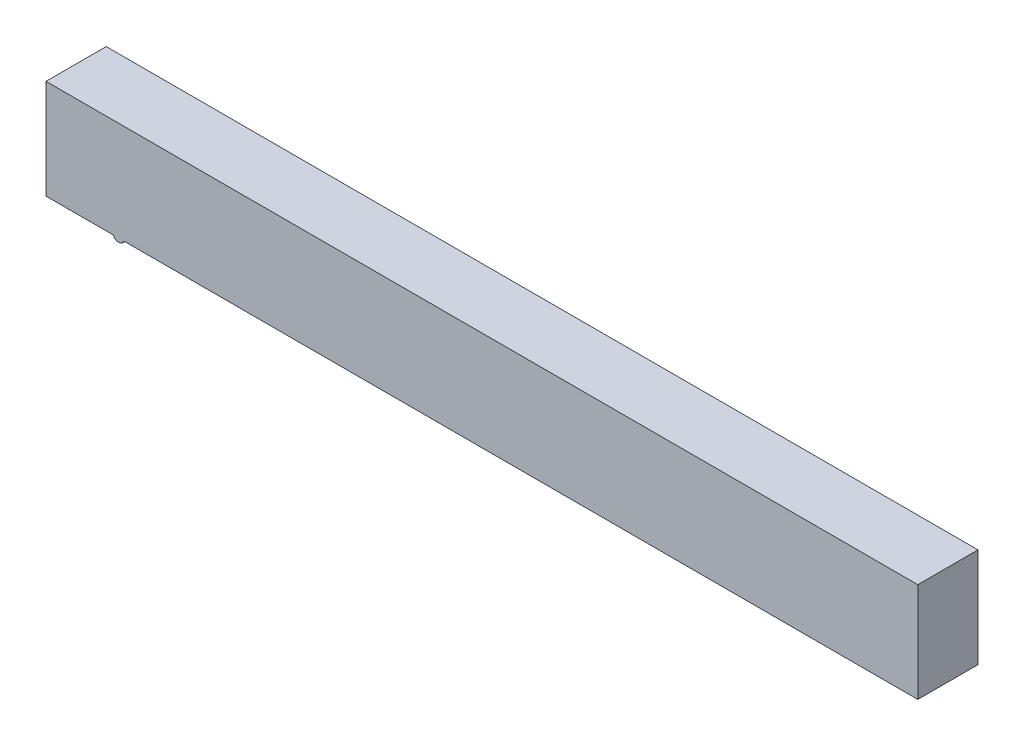
ISO-10303-21;
HEADER;
FILE_DESCRIPTION(('STEP AP214'),'2;1');
FILE_NAME('part.step','',(''),(''),'','','');
FILE_SCHEMA(('AUTOMOTIVE_DESIGN { 1 0 10303 214 1 1 1 1 }'));
ENDSEC;
DATA;
#1=APPLICATION_CONTEXT('core data for automotive mechanical design processes');
#2=APPLICATION_PROTOCOL_DEFINITION('international standard','automotive_design',2000,#1);
#3=PRODUCT_CONTEXT('',#1,'mechanical');
#4=PRODUCT('Part','Part','',(#3));
#5=PRODUCT_RELATED_PRODUCT_CATEGORY('part','',(#4));
#6=PRODUCT_DEFINITION_FORMATION('','',#4);
#7=PRODUCT_DEFINITION_CONTEXT('part definition',#1,'design');
#8=PRODUCT_DEFINITION('design','',#6,#7);
#9=PRODUCT_DEFINITION_SHAPE('','',#8);
#10=(LENGTH_UNIT() NAMED_UNIT(*) SI_UNIT(.MILLI.,.METRE.));
#11=(NAMED_UNIT(*) PLANE_ANGLE_UNIT() SI_UNIT($,.RADIAN.));
#12=(NAMED_UNIT(*) SI_UNIT($,.STERADIAN.) SOLID_ANGLE_UNIT());
#13=UNCERTAINTY_MEASURE_WITH_UNIT(LENGTH_MEASURE(1.E-05),#10,'distance_accuracy_value','');
#14=(GEOMETRIC_REPRESENTATION_CONTEXT(3) GLOBAL_UNCERTAINTY_ASSIGNED_CONTEXT((#13)) GLOBAL_UNIT_ASSIGNED_CONTEXT((#10,
#11,#12)) REPRESENTATION_CONTEXT('',''));
#15=CARTESIAN_POINT('',(0.,0.,0.));
#16=DIRECTION('',(0.,0.,1.));
#17=DIRECTION('',(1.,0.,0.));
#18=AXIS2_PLACEMENT_3D('',#15,#16,#17);
#19=CARTESIAN_POINT('',(-22.86,-2.286,2.));
#20=DIRECTION('',(-0.195145820877009,0.980774239361046,0.));
#21=DIRECTION('',(-0.980774239361046,-0.195145820877009,0.));
#22=AXIS2_PLACEMENT_3D('',#19,#20,#21);
#23=PLANE('',#22);
#24=DIRECTION('',(0.,0.,1.));
#25=VECTOR('',#24,1.);
#26=CARTESIAN_POINT('',(-22.86,-2.286,2.));
#27=LINE('',#26,#25);
#28=CARTESIAN_POINT('',(-22.86,-2.286,6.));
#29=VERTEX_POINT('',#28);
#30=CARTESIAN_POINT('',(-22.86,-2.286,2.));
#31=VERTEX_POINT('',#30);
#32=EDGE_CURVE('E123',#29,#31,#27,.F.);
#33=ORIENTED_EDGE('',*,*,#32,.T.);
#34=DIRECTION('',(-0.980774239361046,-0.195145820877009,0.));
#35=VECTOR('',#34,1.);
#36=CARTESIAN_POINT('',(-22.86,-2.286,2.));
#37=LINE('',#36,#35);
#38=CARTESIAN_POINT('',(-22.7142,-2.25699,2.));
#39=VERTEX_POINT('',#38);
#40=EDGE_CURVE('E20',#39,#31,#37,.T.);
#41=ORIENTED_EDGE('',*,*,#40,.F.);
#42=DIRECTION('',(0.,0.,1.));
#43=VECTOR('',#42,1.);
#44=CARTESIAN_POINT('',(-22.7142,-2.25699,2.));
#45=LINE('',#44,#43);
#46=CARTESIAN_POINT('',(-22.7142,-2.25699,6.));
#47=VERTEX_POINT('',#46);
#48=EDGE_CURVE('E141',#39,#47,#45,.T.);
#49=ORIENTED_EDGE('',*,*,#48,.T.);
#50=DIRECTION('',(-0.980774239361046,-0.195145820877009,0.));
#51=VECTOR('',#50,1.);
#52=CARTESIAN_POINT('',(-22.86,-2.286,6.));
#53=LINE('',#52,#51);
#54=EDGE_CURVE('E109',#29,#47,#53,.F.);
#55=ORIENTED_EDGE('',*,*,#54,.F.);
#56=EDGE_LOOP('',(#33,#41,#49,#55));
#57=FACE_BOUND('',#56,.T.);
#58=ADVANCED_FACE('F17',(#57),#23,.F.);
#59=CARTESIAN_POINT('',(-23.0058,-2.25699,2.));
#60=DIRECTION('',(0.195145820877009,0.980774239361046,0.));
#61=DIRECTION('',(-0.980774239361046,0.195145820877009,0.));
#62=AXIS2_PLACEMENT_3D('',#59,#60,#61);
#63=PLANE('',#62);
#64=DIRECTION('',(0.,0.,1.));
#65=VECTOR('',#64,1.);
#66=CARTESIAN_POINT('',(-23.0058,-2.25699000000003,2.));
#67=LINE('',#66,#65);
#68=CARTESIAN_POINT('',(-23.0058,-2.25699000000001,6.));
#69=VERTEX_POINT('',#68);
#70=CARTESIAN_POINT('',(-23.0058,-2.25699000000001,2.));
#71=VERTEX_POINT('',#70);
#72=EDGE_CURVE('E128',#69,#71,#67,.F.);
#73=ORIENTED_EDGE('',*,*,#72,.T.);
#74=DIRECTION('',(-0.980774239361046,0.195145820877009,0.));
#75=VECTOR('',#74,1.);
#76=CARTESIAN_POINT('',(-23.0058,-2.25699,2.));
#77=LINE('',#76,#75);
#78=EDGE_CURVE('E117',#31,#71,#77,.T.);
#79=ORIENTED_EDGE('',*,*,#78,.F.);
#80=ORIENTED_EDGE('',*,*,#32,.F.);
#81=DIRECTION('',(-0.980774239361046,0.195145820877009,0.));
#82=VECTOR('',#81,1.);
#83=CARTESIAN_POINT('',(-23.0058,-2.25699,6.));
#84=LINE('',#83,#82);
#85=EDGE_CURVE('E130',#69,#29,#84,.F.);
#86=ORIENTED_EDGE('',*,*,#85,.F.);
#87=EDGE_LOOP('',(#73,#79,#80,#86));
#88=FACE_BOUND('',#87,.T.);
#89=ADVANCED_FACE('F126',(#88),#63,.F.);
#90=CARTESIAN_POINT('',(-22.7142,-2.25699,2.));
#91=DIRECTION('',(-0.555584744670956,0.831459915743934,0.));
#92=DIRECTION('',(-0.831459915743934,-0.555584744670956,0.));
#93=AXIS2_PLACEMENT_3D('',#90,#91,#92);
#94=PLANE('',#93);
#95=ORIENTED_EDGE('',*,*,#48,.F.);
#96=DIRECTION('',(-0.831459915743934,-0.555584744670956,0.));
#97=VECTOR('',#96,1.);
#98=CARTESIAN_POINT('',(-22.7142,-2.25699,2.));
#99=LINE('',#98,#97);
#100=CARTESIAN_POINT('',(-22.5906,-2.17439999999999,2.));
#101=VERTEX_POINT('',#100);
#102=EDGE_CURVE('E120',#101,#39,#99,.T.);
#103=ORIENTED_EDGE('',*,*,#102,.F.);
#104=DIRECTION('',(0.,0.,1.));
#105=VECTOR('',#104,1.);
#106=CARTESIAN_POINT('',(-22.5906,-2.1744,2.));
#107=LINE('',#106,#105);
#108=CARTESIAN_POINT('',(-22.5906,-2.17439999999998,6.));
#109=VERTEX_POINT('',#108);
#110=EDGE_CURVE('E146',#101,#109,#107,.T.);
#111=ORIENTED_EDGE('',*,*,#110,.T.);
#112=DIRECTION('',(-0.831459915743934,-0.555584744670956,0.));
#113=VECTOR('',#112,1.);
#114=CARTESIAN_POINT('',(-22.7142,-2.25699,6.));
#115=LINE('',#114,#113);
#116=EDGE_CURVE('E138',#47,#109,#115,.F.);
#117=ORIENTED_EDGE('',*,*,#116,.F.);
#118=EDGE_LOOP('',(#95,#103,#111,#117));
#119=FACE_BOUND('',#118,.T.);
#120=ADVANCED_FACE('F144',(#119),#94,.F.);
#121=CARTESIAN_POINT('',(-23.1294,-2.1744,2.));
#122=DIRECTION('',(0.555584744670956,0.831459915743934,0.));
#123=DIRECTION('',(-0.831459915743934,0.555584744670956,0.));
#124=AXIS2_PLACEMENT_3D('',#121,#122,#123);
#125=PLANE('',#124);
#126=DIRECTION('',(0.,0.,1.));
#127=VECTOR('',#126,1.);
#128=CARTESIAN_POINT('',(-23.1294,-2.17439999999998,2.));
#129=LINE('',#128,#127);
#130=CARTESIAN_POINT('',(-23.1294,-2.17439999999999,6.));
#131=VERTEX_POINT('',#130);
#132=CARTESIAN_POINT('',(-23.1294,-2.17439999999999,2.));
#133=VERTEX_POINT('',#132);
#134=EDGE_CURVE('E160',#131,#133,#129,.F.);
#135=ORIENTED_EDGE('',*,*,#134,.T.);
#136=DIRECTION('',(-0.831459915743934,0.555584744670956,0.));
#137=VECTOR('',#136,1.);
#138=CARTESIAN_POINT('',(-23.1294,-2.1744,2.));
#139=LINE('',#138,#137);
#140=EDGE_CURVE('E149',#71,#133,#139,.T.);
#141=ORIENTED_EDGE('',*,*,#140,.F.);
#142=ORIENTED_EDGE('',*,*,#72,.F.);
#143=DIRECTION('',(-0.831459915743934,0.555584744670956,0.));
#144=VECTOR('',#143,1.);
#145=CARTESIAN_POINT('',(-23.1294,-2.1744,6.));
#146=LINE('',#145,#144);
#147=EDGE_CURVE('E153',#131,#69,#146,.F.);
#148=ORIENTED_EDGE('',*,*,#147,.F.);
#149=EDGE_LOOP('',(#135,#141,#142,#148));
#150=FACE_BOUND('',#149,.T.);
#151=ADVANCED_FACE('F250',(#150),#125,.F.);
#152=CARTESIAN_POINT('',(-22.5906,-2.1744,2.));
#153=DIRECTION('',(-0.831459915743934,0.555584744670956,0.));
#154=DIRECTION('',(-0.555584744670956,-0.831459915743934,0.));
#155=AXIS2_PLACEMENT_3D('',#152,#153,#154);
#156=PLANE('',#155);
#157=ORIENTED_EDGE('',*,*,#110,.F.);
#158=DIRECTION('',(-0.555584744670956,-0.831459915743934,0.));
#159=VECTOR('',#158,1.);
#160=CARTESIAN_POINT('',(-22.5906,-2.1744,2.));
#161=LINE('',#160,#159);
#162=CARTESIAN_POINT('',(-22.50801,-2.05080000000001,2.));
#163=VERTEX_POINT('',#162);
#164=EDGE_CURVE('E155',#163,#101,#161,.T.);
#165=ORIENTED_EDGE('',*,*,#164,.F.);
#166=DIRECTION('',(0.,0.,1.));
#167=VECTOR('',#166,1.);
#168=CARTESIAN_POINT('',(-22.50801,-2.0508,2.));
#169=LINE('',#168,#167);
#170=CARTESIAN_POINT('',(-22.50801,-2.05080000000001,6.));
#171=VERTEX_POINT('',#170);
#172=EDGE_CURVE('E170',#163,#171,#169,.T.);
#173=ORIENTED_EDGE('',*,*,#172,.T.);
#174=DIRECTION('',(-0.555584744670956,-0.831459915743934,0.));
#175=VECTOR('',#174,1.);
#176=CARTESIAN_POINT('',(-22.5906,-2.1744,6.));
#177=LINE('',#176,#175);
#178=EDGE_CURVE('E158',#109,#171,#177,.F.);
#179=ORIENTED_EDGE('',*,*,#178,.F.);
#180=EDGE_LOOP('',(#157,#165,#173,#179));
#181=FACE_BOUND('',#180,.T.);
#182=ADVANCED_FACE('F247',(#181),#156,.F.);
#183=CARTESIAN_POINT('',(-23.21199,-2.0508,2.));
#184=DIRECTION('',(0.831459915743934,0.555584744670956,0.));
#185=DIRECTION('',(-0.555584744670956,0.831459915743934,0.));
#186=AXIS2_PLACEMENT_3D('',#183,#184,#185);
#187=PLANE('',#186);
#188=DIRECTION('',(0.,0.,1.));
#189=VECTOR('',#188,1.);
#190=CARTESIAN_POINT('',(-23.211989999994,-2.05079999999881,2.));
#191=LINE('',#190,#189);
#192=CARTESIAN_POINT('',(-23.2119899999985,-2.0507999999997,6.));
#193=VERTEX_POINT('',#192);
#194=CARTESIAN_POINT('',(-23.2119899999985,-2.0507999999997,2.));
#195=VERTEX_POINT('',#194);
#196=EDGE_CURVE('E173',#193,#195,#191,.F.);
#197=ORIENTED_EDGE('',*,*,#196,.T.);
#198=DIRECTION('',(-0.555584744670956,0.831459915743934,0.));
#199=VECTOR('',#198,1.);
#200=CARTESIAN_POINT('',(-23.21199,-2.0508,2.));
#201=LINE('',#200,#199);
#202=EDGE_CURVE('E163',#133,#195,#201,.T.);
#203=ORIENTED_EDGE('',*,*,#202,.F.);
#204=ORIENTED_EDGE('',*,*,#134,.F.);
#205=DIRECTION('',(-0.555584744670956,0.831459915743934,0.));
#206=VECTOR('',#205,1.);
#207=CARTESIAN_POINT('',(-23.21199,-2.0508,6.));
#208=LINE('',#207,#206);
#209=EDGE_CURVE('E165',#193,#131,#208,.F.);
#210=ORIENTED_EDGE('',*,*,#209,.F.);
#211=EDGE_LOOP('',(#197,#203,#204,#210));
#212=FACE_BOUND('',#211,.T.);
#213=ADVANCED_FACE('F249',(#212),#187,.F.);
#214=CARTESIAN_POINT('',(-22.50801,-2.0508,2.));
#215=DIRECTION('',(-0.980774239361046,0.195145820877009,0.));
#216=DIRECTION('',(-0.195145820877009,-0.980774239361046,0.));
#217=AXIS2_PLACEMENT_3D('',#214,#215,#216);
#218=PLANE('',#217);
#219=ORIENTED_EDGE('',*,*,#172,.F.);
#220=DIRECTION('',(-0.195145820877009,-0.980774239361046,0.));
#221=VECTOR('',#220,1.);
#222=CARTESIAN_POINT('',(-22.50801,-2.0508,2.));
#223=LINE('',#222,#221);
#224=CARTESIAN_POINT('',(-22.5042693415618,-2.03199999999964,2.));
#225=VERTEX_POINT('',#224);
#226=EDGE_CURVE('E168',#225,#163,#223,.T.);
#227=ORIENTED_EDGE('',*,*,#226,.F.);
#228=DIRECTION('',(0.,0.,1.));
#229=VECTOR('',#228,1.);
#230=CARTESIAN_POINT('',(-22.50426934156,-2.032,2.));
#231=LINE('',#230,#229);
#232=CARTESIAN_POINT('',(-22.5042693415618,-2.03199999999964,6.));
#233=VERTEX_POINT('',#232);
#234=EDGE_CURVE('E192',#225,#233,#231,.T.);
#235=ORIENTED_EDGE('',*,*,#234,.T.);
#236=DIRECTION('',(-0.195145821066923,-0.980774239323259,0.));
#237=VECTOR('',#236,1.);
#238=CARTESIAN_POINT('',(-22.50426934156,-2.032,6.));
#239=LINE('',#238,#237);
#240=EDGE_CURVE('E178',#233,#171,#239,.T.);
#241=ORIENTED_EDGE('',*,*,#240,.T.);
#242=EDGE_LOOP('',(#219,#227,#235,#241));
#243=FACE_BOUND('',#242,.T.);
#244=ADVANCED_FACE('F244',(#243),#218,.F.);
#245=CARTESIAN_POINT('',(-23.21573065843,-2.032,2.));
#246=DIRECTION('',(0.980774239361046,0.195145820877009,0.));
#247=DIRECTION('',(-0.195145820877009,0.980774239361046,0.));
#248=AXIS2_PLACEMENT_3D('',#245,#246,#247);
#249=PLANE('',#248);
#250=DIRECTION('',(0.,0.,1.));
#251=VECTOR('',#250,1.);
#252=CARTESIAN_POINT('',(-23.21573065843,-2.032,2.));
#253=LINE('',#252,#251);
#254=CARTESIAN_POINT('',(-23.21573065843,-2.032,6.));
#255=VERTEX_POINT('',#254);
#256=CARTESIAN_POINT('',(-23.21573065843,-2.032,2.));
#257=VERTEX_POINT('',#256);
#258=EDGE_CURVE('E197',#255,#257,#253,.F.);
#259=ORIENTED_EDGE('',*,*,#258,.T.);
#260=DIRECTION('',(-0.195145820877009,0.980774239361046,0.));
#261=VECTOR('',#260,1.);
#262=CARTESIAN_POINT('',(-23.21573065843,-2.032,2.));
#263=LINE('',#262,#261);
#264=EDGE_CURVE('E176',#195,#257,#263,.T.);
#265=ORIENTED_EDGE('',*,*,#264,.F.);
#266=ORIENTED_EDGE('',*,*,#196,.F.);
#267=DIRECTION('',(-0.195145820564806,0.980774239423165,0.));
#268=VECTOR('',#267,1.);
#269=CARTESIAN_POINT('',(-23.21199,-2.0508,6.));
#270=LINE('',#269,#268);
#271=EDGE_CURVE('E181',#193,#255,#270,.T.);
#272=ORIENTED_EDGE('',*,*,#271,.T.);
#273=EDGE_LOOP('',(#259,#265,#266,#272));
#274=FACE_BOUND('',#273,.T.);
#275=ADVANCED_FACE('F222',(#274),#249,.F.);
#276=CARTESIAN_POINT('',(30.226,4.572,6.));
#277=DIRECTION('',(0.,0.,-1.));
#278=DIRECTION('',(-1.,0.,0.));
#279=AXIS2_PLACEMENT_3D('',#276,#277,#278);
#280=PLANE('',#279);
#281=DIRECTION('',(1.,0.,0.));
#282=VECTOR('',#281,1.);
#283=CARTESIAN_POINT('',(-27.686,-2.032,6.));
#284=LINE('',#283,#282);
#285=CARTESIAN_POINT('',(-27.686,-2.032,6.));
#286=VERTEX_POINT('',#285);
#287=EDGE_CURVE('E200',#286,#255,#284,.T.);
#288=ORIENTED_EDGE('',*,*,#287,.T.);
#289=ORIENTED_EDGE('',*,*,#271,.F.);
#290=ORIENTED_EDGE('',*,*,#209,.T.);
#291=ORIENTED_EDGE('',*,*,#147,.T.);
#292=ORIENTED_EDGE('',*,*,#85,.T.);
#293=ORIENTED_EDGE('',*,*,#54,.T.);
#294=ORIENTED_EDGE('',*,*,#116,.T.);
#295=ORIENTED_EDGE('',*,*,#178,.T.);
#296=ORIENTED_EDGE('',*,*,#240,.F.);
#297=DIRECTION('',(1.,0.,0.));
#298=VECTOR('',#297,1.);
#299=CARTESIAN_POINT('',(-22.50426934156,-2.032,6.));
#300=LINE('',#299,#298);
#301=CARTESIAN_POINT('',(30.226,-2.032,6.));
#302=VERTEX_POINT('',#301);
#303=EDGE_CURVE('E194',#233,#302,#300,.T.);
#304=ORIENTED_EDGE('',*,*,#303,.T.);
#305=DIRECTION('',(0.,1.,0.));
#306=VECTOR('',#305,1.);
#307=CARTESIAN_POINT('',(30.226,-2.032,6.));
#308=LINE('',#307,#306);
#309=CARTESIAN_POINT('',(30.226,4.572,6.));
#310=VERTEX_POINT('',#309);
#311=EDGE_CURVE('E187',#302,#310,#308,.T.);
#312=ORIENTED_EDGE('',*,*,#311,.T.);
#313=DIRECTION('',(1.,0.,0.));
#314=VECTOR('',#313,1.);
#315=CARTESIAN_POINT('',(30.226,4.572,6.));
#316=LINE('',#315,#314);
#317=CARTESIAN_POINT('',(-27.686,4.572,6.));
#318=VERTEX_POINT('',#317);
#319=EDGE_CURVE('E183',#310,#318,#316,.F.);
#320=ORIENTED_EDGE('',*,*,#319,.T.);
#321=DIRECTION('',(0.,1.,0.));
#322=VECTOR('',#321,1.);
#323=CARTESIAN_POINT('',(-27.686,4.572,6.));
#324=LINE('',#323,#322);
#325=EDGE_CURVE('E206',#318,#286,#324,.F.);
#326=ORIENTED_EDGE('',*,*,#325,.T.);
#327=EDGE_LOOP('',(#288,#289,#290,#291,#292,#293,#294,#295,#296,#304,#312,#320,#326));
#328=FACE_BOUND('',#327,.T.);
#329=ADVANCED_FACE('F136',(#328),#280,.F.);
#330=CARTESIAN_POINT('',(30.226,4.572,2.));
#331=DIRECTION('',(0.,-1.,0.));
#332=DIRECTION('',(0.,0.,-1.));
#333=AXIS2_PLACEMENT_3D('',#330,#331,#332);
#334=PLANE('',#333);
#335=DIRECTION('',(0.,0.,1.));
#336=VECTOR('',#335,1.);
#337=CARTESIAN_POINT('',(30.226,4.572,2.));
#338=LINE('',#337,#336);
#339=CARTESIAN_POINT('',(30.226,4.572,2.));
#340=VERTEX_POINT('',#339);
#341=EDGE_CURVE('E185',#310,#340,#338,.F.);
#342=ORIENTED_EDGE('',*,*,#341,.T.);
#343=DIRECTION('',(-1.,0.,0.));
#344=VECTOR('',#343,1.);
#345=CARTESIAN_POINT('',(30.226,4.572,2.));
#346=LINE('',#345,#344);
#347=CARTESIAN_POINT('',(-27.686,4.572,2.));
#348=VERTEX_POINT('',#347);
#349=EDGE_CURVE('E209',#348,#340,#346,.F.);
#350=ORIENTED_EDGE('',*,*,#349,.F.);
#351=DIRECTION('',(0.,0.,-1.));
#352=VECTOR('',#351,1.);
#353=CARTESIAN_POINT('',(-27.686,4.572,2.));
#354=LINE('',#353,#352);
#355=EDGE_CURVE('E203',#348,#318,#354,.F.);
#356=ORIENTED_EDGE('',*,*,#355,.T.);
#357=ORIENTED_EDGE('',*,*,#319,.F.);
#358=EDGE_LOOP('',(#342,#350,#356,#357));
#359=FACE_BOUND('',#358,.T.);
#360=ADVANCED_FACE('F230',(#359),#334,.F.);
#361=CARTESIAN_POINT('',(30.226,-2.032,2.));
#362=DIRECTION('',(-1.,0.,0.));
#363=DIRECTION('',(0.,0.,1.));
#364=AXIS2_PLACEMENT_3D('',#361,#362,#363);
#365=PLANE('',#364);
#366=DIRECTION('',(0.,0.,1.));
#367=VECTOR('',#366,1.);
#368=CARTESIAN_POINT('',(30.226,-2.032,2.));
#369=LINE('',#368,#367);
#370=CARTESIAN_POINT('',(30.226,-2.032,2.));
#371=VERTEX_POINT('',#370);
#372=EDGE_CURVE('E190',#302,#371,#369,.F.);
#373=ORIENTED_EDGE('',*,*,#372,.T.);
#374=DIRECTION('',(0.,1.,0.));
#375=VECTOR('',#374,1.);
#376=CARTESIAN_POINT('',(30.226,4.572,2.));
#377=LINE('',#376,#375);
#378=EDGE_CURVE('E212',#340,#371,#377,.F.);
#379=ORIENTED_EDGE('',*,*,#378,.F.);
#380=ORIENTED_EDGE('',*,*,#341,.F.);
#381=ORIENTED_EDGE('',*,*,#311,.F.);
#382=EDGE_LOOP('',(#373,#379,#380,#381));
#383=FACE_BOUND('',#382,.T.);
#384=ADVANCED_FACE('F235',(#383),#365,.F.);
#385=CARTESIAN_POINT('',(-22.50426934156,-2.032,2.));
#386=DIRECTION('',(0.,1.,0.));
#387=DIRECTION('',(0.,0.,1.));
#388=AXIS2_PLACEMENT_3D('',#385,#386,#387);
#389=PLANE('',#388);
#390=ORIENTED_EDGE('',*,*,#234,.F.);
#391=DIRECTION('',(-1.,0.,0.));
#392=VECTOR('',#391,1.);
#393=CARTESIAN_POINT('',(30.226,-2.032,2.));
#394=LINE('',#393,#392);
#395=EDGE_CURVE('E215',#371,#225,#394,.T.);
#396=ORIENTED_EDGE('',*,*,#395,.F.);
#397=ORIENTED_EDGE('',*,*,#372,.F.);
#398=ORIENTED_EDGE('',*,*,#303,.F.);
#399=EDGE_LOOP('',(#390,#396,#397,#398));
#400=FACE_BOUND('',#399,.T.);
#401=ADVANCED_FACE('F240',(#400),#389,.F.);
#402=CARTESIAN_POINT('',(-27.686,-2.032,2.));
#403=DIRECTION('',(0.,1.,0.));
#404=DIRECTION('',(0.,0.,1.));
#405=AXIS2_PLACEMENT_3D('',#402,#403,#404);
#406=PLANE('',#405);
#407=DIRECTION('',(0.,0.,-1.));
#408=VECTOR('',#407,1.);
#409=CARTESIAN_POINT('',(-27.686,-2.032,2.));
#410=LINE('',#409,#408);
#411=CARTESIAN_POINT('',(-27.686,-2.032,2.));
#412=VERTEX_POINT('',#411);
#413=EDGE_CURVE('E35',#286,#412,#410,.T.);
#414=ORIENTED_EDGE('',*,*,#413,.T.);
#415=DIRECTION('',(-1.,0.,0.));
#416=VECTOR('',#415,1.);
#417=CARTESIAN_POINT('',(30.226,-2.032,2.));
#418=LINE('',#417,#416);
#419=EDGE_CURVE('E26',#257,#412,#418,.T.);
#420=ORIENTED_EDGE('',*,*,#419,.F.);
#421=ORIENTED_EDGE('',*,*,#258,.F.);
#422=ORIENTED_EDGE('',*,*,#287,.F.);
#423=EDGE_LOOP('',(#414,#420,#421,#422));
#424=FACE_BOUND('',#423,.T.);
#425=ADVANCED_FACE('F220',(#424),#406,.F.);
#426=CARTESIAN_POINT('',(-27.686,4.572,2.));
#427=DIRECTION('',(1.,0.,0.));
#428=DIRECTION('',(0.,0.,-1.));
#429=AXIS2_PLACEMENT_3D('',#426,#427,#428);
#430=PLANE('',#429);
#431=ORIENTED_EDGE('',*,*,#355,.F.);
#432=DIRECTION('',(0.,1.,0.));
#433=VECTOR('',#432,1.);
#434=CARTESIAN_POINT('',(-27.686,4.572,2.));
#435=LINE('',#434,#433);
#436=EDGE_CURVE('E11',#412,#348,#435,.T.);
#437=ORIENTED_EDGE('',*,*,#436,.F.);
#438=ORIENTED_EDGE('',*,*,#413,.F.);
#439=ORIENTED_EDGE('',*,*,#325,.F.);
#440=EDGE_LOOP('',(#431,#437,#438,#439));
#441=FACE_BOUND('',#440,.T.);
#442=ADVANCED_FACE('F228',(#441),#430,.F.);
#443=CARTESIAN_POINT('',(30.226,4.572,2.));
#444=DIRECTION('',(0.,0.,-1.));
#445=DIRECTION('',(-1.,0.,0.));
#446=AXIS2_PLACEMENT_3D('',#443,#444,#445);
#447=PLANE('',#446);
#448=ORIENTED_EDGE('',*,*,#419,.T.);
#449=ORIENTED_EDGE('',*,*,#436,.T.);
#450=ORIENTED_EDGE('',*,*,#349,.T.);
#451=ORIENTED_EDGE('',*,*,#378,.T.);
#452=ORIENTED_EDGE('',*,*,#395,.T.);
#453=ORIENTED_EDGE('',*,*,#226,.T.);
#454=ORIENTED_EDGE('',*,*,#164,.T.);
#455=ORIENTED_EDGE('',*,*,#102,.T.);
#456=ORIENTED_EDGE('',*,*,#40,.T.);
#457=ORIENTED_EDGE('',*,*,#78,.T.);
#458=ORIENTED_EDGE('',*,*,#140,.T.);
#459=ORIENTED_EDGE('',*,*,#202,.T.);
#460=ORIENTED_EDGE('',*,*,#264,.T.);
#461=EDGE_LOOP('',(#448,#449,#450,#451,#452,#453,#454,#455,#456,#457,#458,#459,#460));
#462=FACE_BOUND('',#461,.T.);
#463=ADVANCED_FACE('F115',(#462),#447,.T.);
#464=CLOSED_SHELL('',(#58,#89,#120,#151,#182,#213,#244,#275,#329,#360,#384,#401,#425,#442,#463));
#465=MANIFOLD_SOLID_BREP('B1',#464);
#466=ADVANCED_BREP_SHAPE_REPRESENTATION('',(#18,#465),#14);
#467=SHAPE_DEFINITION_REPRESENTATION(#9,#466);
ENDSEC;
END-ISO-10303-21;
